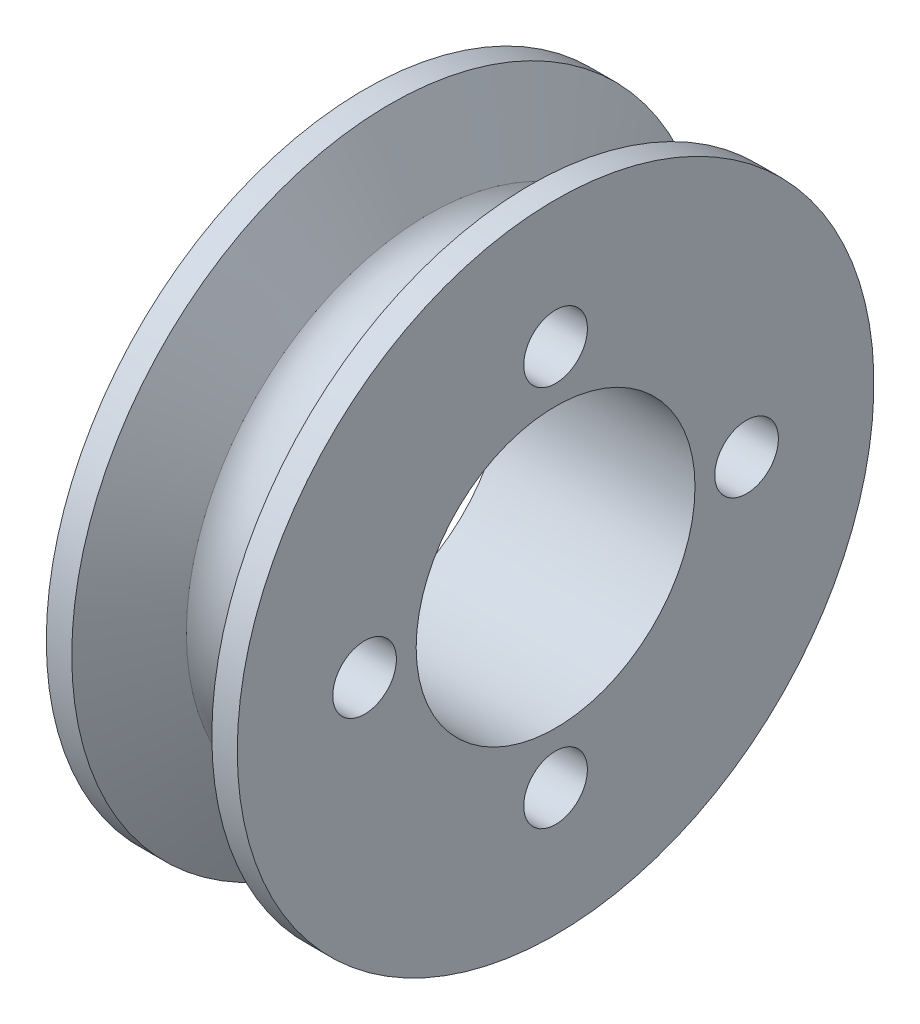
ISO-10303-21;
HEADER;
FILE_DESCRIPTION(('STEP AP214'),'2;1');
FILE_NAME('part.step','',(''),(''),'','','');
FILE_SCHEMA(('AUTOMOTIVE_DESIGN { 1 0 10303 214 1 1 1 1 }'));
ENDSEC;
DATA;
#1=APPLICATION_CONTEXT('core data for automotive mechanical design processes');
#2=APPLICATION_PROTOCOL_DEFINITION('international standard','automotive_design',2000,#1);
#3=PRODUCT_CONTEXT('',#1,'mechanical');
#4=PRODUCT('Part','Part','',(#3));
#5=PRODUCT_RELATED_PRODUCT_CATEGORY('part','',(#4));
#6=PRODUCT_DEFINITION_FORMATION('','',#4);
#7=PRODUCT_DEFINITION_CONTEXT('part definition',#1,'design');
#8=PRODUCT_DEFINITION('design','',#6,#7);
#9=PRODUCT_DEFINITION_SHAPE('','',#8);
#10=(LENGTH_UNIT() NAMED_UNIT(*) SI_UNIT(.MILLI.,.METRE.));
#11=(NAMED_UNIT(*) PLANE_ANGLE_UNIT() SI_UNIT($,.RADIAN.));
#12=(NAMED_UNIT(*) SI_UNIT($,.STERADIAN.) SOLID_ANGLE_UNIT());
#13=UNCERTAINTY_MEASURE_WITH_UNIT(LENGTH_MEASURE(1.E-05),#10,'distance_accuracy_value','');
#14=(GEOMETRIC_REPRESENTATION_CONTEXT(3) GLOBAL_UNCERTAINTY_ASSIGNED_CONTEXT((#13)) GLOBAL_UNIT_ASSIGNED_CONTEXT((#10,
#11,#12)) REPRESENTATION_CONTEXT('',''));
#15=CARTESIAN_POINT('',(0.,0.,0.));
#16=DIRECTION('',(0.,0.,1.));
#17=DIRECTION('',(1.,0.,0.));
#18=AXIS2_PLACEMENT_3D('',#15,#16,#17);
#19=CARTESIAN_POINT('',(5.95223912932069,-20.2543845102429,0.));
#20=DIRECTION('',(1.,0.,0.));
#21=DIRECTION('',(0.,0.,-1.));
#22=AXIS2_PLACEMENT_3D('',#19,#20,#21);
#23=CONICAL_SURFACE('',#22,25.,1.10714871779409);
#24=CARTESIAN_POINT('',(2.95223912932069,-20.2543845102429,0.));
#25=DIRECTION('',(-1.,0.,0.));
#26=DIRECTION('',(0.,0.,1.));
#27=AXIS2_PLACEMENT_3D('',#24,#25,#26);
#28=CIRCLE('',#27,19.);
#29=CARTESIAN_POINT('',(2.95223912932069,-20.2543845102429,19.));
#30=VERTEX_POINT('',#29);
#31=EDGE_CURVE('E10',#30,#30,#28,.T.);
#32=ORIENTED_EDGE('',*,*,#31,.F.);
#33=EDGE_LOOP('',(#32));
#34=FACE_BOUND('',#33,.T.);
#35=CARTESIAN_POINT('',(5.95223912932069,-20.2543845102429,0.));
#36=DIRECTION('',(-1.,0.,0.));
#37=DIRECTION('',(0.,0.,1.));
#38=AXIS2_PLACEMENT_3D('',#35,#36,#37);
#39=CIRCLE('',#38,25.);
#40=CARTESIAN_POINT('',(5.95223912932069,-20.2543845102429,25.));
#41=VERTEX_POINT('',#40);
#42=EDGE_CURVE('E72',#41,#41,#39,.T.);
#43=ORIENTED_EDGE('',*,*,#42,.T.);
#44=EDGE_LOOP('',(#43));
#45=FACE_BOUND('',#44,.T.);
#46=ADVANCED_FACE('F45',(#34,#45),#23,.T.);
#47=CARTESIAN_POINT('',(0.452239129320691,-20.2543845102429,0.));
#48=DIRECTION('',(-1.,0.,0.));
#49=DIRECTION('',(0.,0.,1.));
#50=AXIS2_PLACEMENT_3D('',#47,#48,#49);
#51=TOROIDAL_SURFACE('',#50,21.,3.20156211871642);
#52=CARTESIAN_POINT('',(-2.0477608706793,-20.2543845102429,0.));
#53=DIRECTION('',(-1.,0.,0.));
#54=DIRECTION('',(0.,0.,1.));
#55=AXIS2_PLACEMENT_3D('',#52,#53,#54);
#56=CIRCLE('',#55,19.);
#57=CARTESIAN_POINT('',(-2.0477608706793,-20.2543845102429,19.));
#58=VERTEX_POINT('',#57);
#59=EDGE_CURVE('E53',#58,#58,#56,.T.);
#60=ORIENTED_EDGE('',*,*,#59,.F.);
#61=EDGE_LOOP('',(#60));
#62=FACE_BOUND('',#61,.T.);
#63=ORIENTED_EDGE('',*,*,#31,.T.);
#64=EDGE_LOOP('',(#63));
#65=FACE_BOUND('',#64,.T.);
#66=ADVANCED_FACE('F140',(#62,#65),#51,.F.);
#67=CARTESIAN_POINT('',(-5.0477608706793,-20.2543845102429,0.));
#68=DIRECTION('',(-1.,0.,0.));
#69=DIRECTION('',(0.,0.,1.));
#70=AXIS2_PLACEMENT_3D('',#67,#68,#69);
#71=CONICAL_SURFACE('',#70,25.,1.10714871779409);
#72=ORIENTED_EDGE('',*,*,#59,.T.);
#73=EDGE_LOOP('',(#72));
#74=FACE_BOUND('',#73,.T.);
#75=CARTESIAN_POINT('',(-5.0477608706793,-20.2543845102429,0.));
#76=DIRECTION('',(-1.,0.,0.));
#77=DIRECTION('',(0.,0.,1.));
#78=AXIS2_PLACEMENT_3D('',#75,#76,#77);
#79=CIRCLE('',#78,25.);
#80=CARTESIAN_POINT('',(-5.0477608706793,-20.2543845102429,25.));
#81=VERTEX_POINT('',#80);
#82=EDGE_CURVE('E58',#81,#81,#79,.T.);
#83=ORIENTED_EDGE('',*,*,#82,.F.);
#84=EDGE_LOOP('',(#83));
#85=FACE_BOUND('',#84,.T.);
#86=ADVANCED_FACE('F145',(#74,#85),#71,.T.);
#87=CARTESIAN_POINT('',(-20.8444071831921,-20.2543845102429,0.));
#88=DIRECTION('',(-1.,0.,0.));
#89=DIRECTION('',(0.,0.,1.));
#90=AXIS2_PLACEMENT_3D('',#87,#88,#89);
#91=CYLINDRICAL_SURFACE('',#90,25.);
#92=ORIENTED_EDGE('',*,*,#82,.T.);
#93=EDGE_LOOP('',(#92));
#94=FACE_BOUND('',#93,.T.);
#95=CARTESIAN_POINT('',(-7.04776087067931,-20.2543845102429,0.));
#96=DIRECTION('',(-1.,0.,0.));
#97=DIRECTION('',(0.,0.,1.));
#98=AXIS2_PLACEMENT_3D('',#95,#96,#97);
#99=CIRCLE('',#98,25.);
#100=CARTESIAN_POINT('',(-7.04776087067931,-20.2543845102429,25.));
#101=VERTEX_POINT('',#100);
#102=EDGE_CURVE('E64',#101,#101,#99,.T.);
#103=ORIENTED_EDGE('',*,*,#102,.F.);
#104=EDGE_LOOP('',(#103));
#105=FACE_BOUND('',#104,.T.);
#106=ADVANCED_FACE('F150',(#94,#105),#91,.T.);
#107=CARTESIAN_POINT('',(-7.04776087067931,0.,0.));
#108=DIRECTION('',(1.,0.,0.));
#109=DIRECTION('',(0.,0.,-1.));
#110=AXIS2_PLACEMENT_3D('',#107,#108,#109);
#111=PLANE('',#110);
#112=CARTESIAN_POINT('',(-7.04776087067931,-20.2543845102429,15.));
#113=DIRECTION('',(1.,0.,0.));
#114=DIRECTION('',(0.,0.,-1.));
#115=AXIS2_PLACEMENT_3D('',#112,#113,#114);
#116=CIRCLE('',#115,2.5);
#117=CARTESIAN_POINT('',(-7.04776087067931,-20.2543845102429,12.5));
#118=VERTEX_POINT('',#117);
#119=EDGE_CURVE('E80',#118,#118,#116,.T.);
#120=ORIENTED_EDGE('',*,*,#119,.T.);
#121=EDGE_LOOP('',(#120));
#122=FACE_BOUND('',#121,.T.);
#123=CARTESIAN_POINT('',(-7.04776087067931,-35.2543845102429,0.));
#124=DIRECTION('',(1.,0.,0.));
#125=DIRECTION('',(0.,0.,-1.));
#126=AXIS2_PLACEMENT_3D('',#123,#124,#125);
#127=CIRCLE('',#126,2.5);
#128=CARTESIAN_POINT('',(-7.04776087067931,-35.2543845102429,-2.5));
#129=VERTEX_POINT('',#128);
#130=EDGE_CURVE('E84',#129,#129,#127,.T.);
#131=ORIENTED_EDGE('',*,*,#130,.T.);
#132=EDGE_LOOP('',(#131));
#133=FACE_BOUND('',#132,.T.);
#134=CARTESIAN_POINT('',(-7.04776087067931,-20.2543845102429,-15.));
#135=DIRECTION('',(1.,0.,0.));
#136=DIRECTION('',(0.,0.,-1.));
#137=AXIS2_PLACEMENT_3D('',#134,#135,#136);
#138=CIRCLE('',#137,2.5);
#139=CARTESIAN_POINT('',(-7.04776087067931,-20.2543845102429,-17.5));
#140=VERTEX_POINT('',#139);
#141=EDGE_CURVE('E88',#140,#140,#138,.T.);
#142=ORIENTED_EDGE('',*,*,#141,.T.);
#143=EDGE_LOOP('',(#142));
#144=FACE_BOUND('',#143,.T.);
#145=CARTESIAN_POINT('',(-7.04776087067931,-5.25438451024291,0.));
#146=DIRECTION('',(1.,0.,0.));
#147=DIRECTION('',(0.,0.,-1.));
#148=AXIS2_PLACEMENT_3D('',#145,#146,#147);
#149=CIRCLE('',#148,2.5);
#150=CARTESIAN_POINT('',(-7.04776087067931,-5.25438451024291,-2.5));
#151=VERTEX_POINT('',#150);
#152=EDGE_CURVE('E92',#151,#151,#149,.T.);
#153=ORIENTED_EDGE('',*,*,#152,.T.);
#154=EDGE_LOOP('',(#153));
#155=FACE_BOUND('',#154,.T.);
#156=CARTESIAN_POINT('',(-7.04776087067931,-20.2543845102429,0.));
#157=DIRECTION('',(-1.,0.,0.));
#158=DIRECTION('',(0.,0.,1.));
#159=AXIS2_PLACEMENT_3D('',#156,#157,#158);
#160=CIRCLE('',#159,10.95);
#161=CARTESIAN_POINT('',(-7.04776087067931,-20.2543845102429,10.95));
#162=VERTEX_POINT('',#161);
#163=EDGE_CURVE('E76',#162,#162,#160,.T.);
#164=ORIENTED_EDGE('',*,*,#163,.F.);
#165=EDGE_LOOP('',(#164));
#166=FACE_BOUND('',#165,.T.);
#167=ORIENTED_EDGE('',*,*,#102,.T.);
#168=EDGE_LOOP('',(#167));
#169=FACE_BOUND('',#168,.T.);
#170=ADVANCED_FACE('F120',(#122,#133,#144,#155,#166,#169),#111,.F.);
#171=CARTESIAN_POINT('',(7.95223912932069,0.,0.));
#172=DIRECTION('',(1.,0.,0.));
#173=DIRECTION('',(0.,0.,-1.));
#174=AXIS2_PLACEMENT_3D('',#171,#172,#173);
#175=PLANE('',#174);
#176=CARTESIAN_POINT('',(7.95223912932069,-20.2543845102429,15.));
#177=DIRECTION('',(1.,0.,0.));
#178=DIRECTION('',(0.,0.,-1.));
#179=AXIS2_PLACEMENT_3D('',#176,#177,#178);
#180=CIRCLE('',#179,2.5);
#181=CARTESIAN_POINT('',(7.95223912932069,-20.2543845102429,12.5));
#182=VERTEX_POINT('',#181);
#183=EDGE_CURVE('E96',#182,#182,#180,.T.);
#184=ORIENTED_EDGE('',*,*,#183,.F.);
#185=EDGE_LOOP('',(#184));
#186=FACE_BOUND('',#185,.T.);
#187=CARTESIAN_POINT('',(7.95223912932069,-35.2543845102429,0.));
#188=DIRECTION('',(1.,0.,0.));
#189=DIRECTION('',(0.,0.,-1.));
#190=AXIS2_PLACEMENT_3D('',#187,#188,#189);
#191=CIRCLE('',#190,2.5);
#192=CARTESIAN_POINT('',(7.95223912932069,-35.2543845102429,-2.5));
#193=VERTEX_POINT('',#192);
#194=EDGE_CURVE('E105',#193,#193,#191,.T.);
#195=ORIENTED_EDGE('',*,*,#194,.F.);
#196=EDGE_LOOP('',(#195));
#197=FACE_BOUND('',#196,.T.);
#198=CARTESIAN_POINT('',(7.95223912932069,-20.2543845102429,-15.));
#199=DIRECTION('',(1.,0.,0.));
#200=DIRECTION('',(0.,0.,-1.));
#201=AXIS2_PLACEMENT_3D('',#198,#199,#200);
#202=CIRCLE('',#201,2.5);
#203=CARTESIAN_POINT('',(7.95223912932069,-20.2543845102429,-17.5));
#204=VERTEX_POINT('',#203);
#205=EDGE_CURVE('E101',#204,#204,#202,.T.);
#206=ORIENTED_EDGE('',*,*,#205,.F.);
#207=EDGE_LOOP('',(#206));
#208=FACE_BOUND('',#207,.T.);
#209=CARTESIAN_POINT('',(7.95223912932069,-5.25438451024291,0.));
#210=DIRECTION('',(1.,0.,0.));
#211=DIRECTION('',(0.,0.,-1.));
#212=AXIS2_PLACEMENT_3D('',#209,#210,#211);
#213=CIRCLE('',#212,2.5);
#214=CARTESIAN_POINT('',(7.95223912932069,-5.25438451024291,-2.5));
#215=VERTEX_POINT('',#214);
#216=EDGE_CURVE('E97',#215,#215,#213,.T.);
#217=ORIENTED_EDGE('',*,*,#216,.F.);
#218=EDGE_LOOP('',(#217));
#219=FACE_BOUND('',#218,.T.);
#220=CARTESIAN_POINT('',(7.95223912932069,-20.2543845102429,0.));
#221=DIRECTION('',(1.,0.,0.));
#222=DIRECTION('',(0.,0.,-1.));
#223=AXIS2_PLACEMENT_3D('',#220,#221,#222);
#224=CIRCLE('',#223,10.95);
#225=CARTESIAN_POINT('',(7.95223912932069,-20.2543845102429,-10.95));
#226=VERTEX_POINT('',#225);
#227=EDGE_CURVE('E48',#226,#226,#224,.T.);
#228=ORIENTED_EDGE('',*,*,#227,.F.);
#229=EDGE_LOOP('',(#228));
#230=FACE_BOUND('',#229,.T.);
#231=CARTESIAN_POINT('',(7.95223912932069,-20.2543845102429,0.));
#232=DIRECTION('',(-1.,0.,0.));
#233=DIRECTION('',(0.,0.,1.));
#234=AXIS2_PLACEMENT_3D('',#231,#232,#233);
#235=CIRCLE('',#234,25.);
#236=CARTESIAN_POINT('',(7.95223912932069,-20.2543845102429,25.));
#237=VERTEX_POINT('',#236);
#238=EDGE_CURVE('E68',#237,#237,#235,.T.);
#239=ORIENTED_EDGE('',*,*,#238,.F.);
#240=EDGE_LOOP('',(#239));
#241=FACE_BOUND('',#240,.T.);
#242=ADVANCED_FACE('F116',(#186,#197,#208,#219,#230,#241),#175,.T.);
#243=CARTESIAN_POINT('',(-20.8444071831921,-20.2543845102429,0.));
#244=DIRECTION('',(-1.,0.,0.));
#245=DIRECTION('',(0.,0.,1.));
#246=AXIS2_PLACEMENT_3D('',#243,#244,#245);
#247=CYLINDRICAL_SURFACE('',#246,25.);
#248=ORIENTED_EDGE('',*,*,#238,.T.);
#249=EDGE_LOOP('',(#248));
#250=FACE_BOUND('',#249,.T.);
#251=ORIENTED_EDGE('',*,*,#42,.F.);
#252=EDGE_LOOP('',(#251));
#253=FACE_BOUND('',#252,.T.);
#254=ADVANCED_FACE('F119',(#250,#253),#247,.T.);
#255=CARTESIAN_POINT('',(108.752239129321,-20.2543845102429,0.));
#256=DIRECTION('',(-1.,0.,0.));
#257=DIRECTION('',(0.,0.,1.));
#258=AXIS2_PLACEMENT_3D('',#255,#256,#257);
#259=CYLINDRICAL_SURFACE('',#258,10.95);
#260=ORIENTED_EDGE('',*,*,#227,.T.);
#261=EDGE_LOOP('',(#260));
#262=FACE_BOUND('',#261,.T.);
#263=ORIENTED_EDGE('',*,*,#163,.T.);
#264=EDGE_LOOP('',(#263));
#265=FACE_BOUND('',#264,.T.);
#266=ADVANCED_FACE('F135',(#262,#265),#259,.F.);
#267=CARTESIAN_POINT('',(-35.0477608706793,-5.25438451024291,0.));
#268=DIRECTION('',(1.,0.,0.));
#269=DIRECTION('',(0.,0.,-1.));
#270=AXIS2_PLACEMENT_3D('',#267,#268,#269);
#271=CYLINDRICAL_SURFACE('',#270,2.5);
#272=ORIENTED_EDGE('',*,*,#216,.T.);
#273=EDGE_LOOP('',(#272));
#274=FACE_BOUND('',#273,.T.);
#275=ORIENTED_EDGE('',*,*,#152,.F.);
#276=EDGE_LOOP('',(#275));
#277=FACE_BOUND('',#276,.T.);
#278=ADVANCED_FACE('F163',(#274,#277),#271,.F.);
#279=CARTESIAN_POINT('',(-35.0477608706793,-20.2543845102429,-15.));
#280=DIRECTION('',(1.,0.,0.));
#281=DIRECTION('',(0.,0.,-1.));
#282=AXIS2_PLACEMENT_3D('',#279,#280,#281);
#283=CYLINDRICAL_SURFACE('',#282,2.5);
#284=ORIENTED_EDGE('',*,*,#205,.T.);
#285=EDGE_LOOP('',(#284));
#286=FACE_BOUND('',#285,.T.);
#287=ORIENTED_EDGE('',*,*,#141,.F.);
#288=EDGE_LOOP('',(#287));
#289=FACE_BOUND('',#288,.T.);
#290=ADVANCED_FACE('F167',(#286,#289),#283,.F.);
#291=CARTESIAN_POINT('',(-35.0477608706793,-35.2543845102429,0.));
#292=DIRECTION('',(1.,0.,0.));
#293=DIRECTION('',(0.,0.,-1.));
#294=AXIS2_PLACEMENT_3D('',#291,#292,#293);
#295=CYLINDRICAL_SURFACE('',#294,2.5);
#296=ORIENTED_EDGE('',*,*,#194,.T.);
#297=EDGE_LOOP('',(#296));
#298=FACE_BOUND('',#297,.T.);
#299=ORIENTED_EDGE('',*,*,#130,.F.);
#300=EDGE_LOOP('',(#299));
#301=FACE_BOUND('',#300,.T.);
#302=ADVANCED_FACE('F171',(#298,#301),#295,.F.);
#303=CARTESIAN_POINT('',(-35.0477608706793,-20.2543845102429,15.));
#304=DIRECTION('',(1.,0.,0.));
#305=DIRECTION('',(0.,0.,-1.));
#306=AXIS2_PLACEMENT_3D('',#303,#304,#305);
#307=CYLINDRICAL_SURFACE('',#306,2.5);
#308=ORIENTED_EDGE('',*,*,#183,.T.);
#309=EDGE_LOOP('',(#308));
#310=FACE_BOUND('',#309,.T.);
#311=ORIENTED_EDGE('',*,*,#119,.F.);
#312=EDGE_LOOP('',(#311));
#313=FACE_BOUND('',#312,.T.);
#314=ADVANCED_FACE('F113',(#310,#313),#307,.F.);
#315=CLOSED_SHELL('',(#46,#66,#86,#106,#170,#242,#254,#266,#278,#290,#302,#314));
#316=MANIFOLD_SOLID_BREP('B2',#315);
#317=ADVANCED_BREP_SHAPE_REPRESENTATION('',(#18,#316),#14);
#318=SHAPE_DEFINITION_REPRESENTATION(#9,#317);
ENDSEC;
END-ISO-10303-21;
